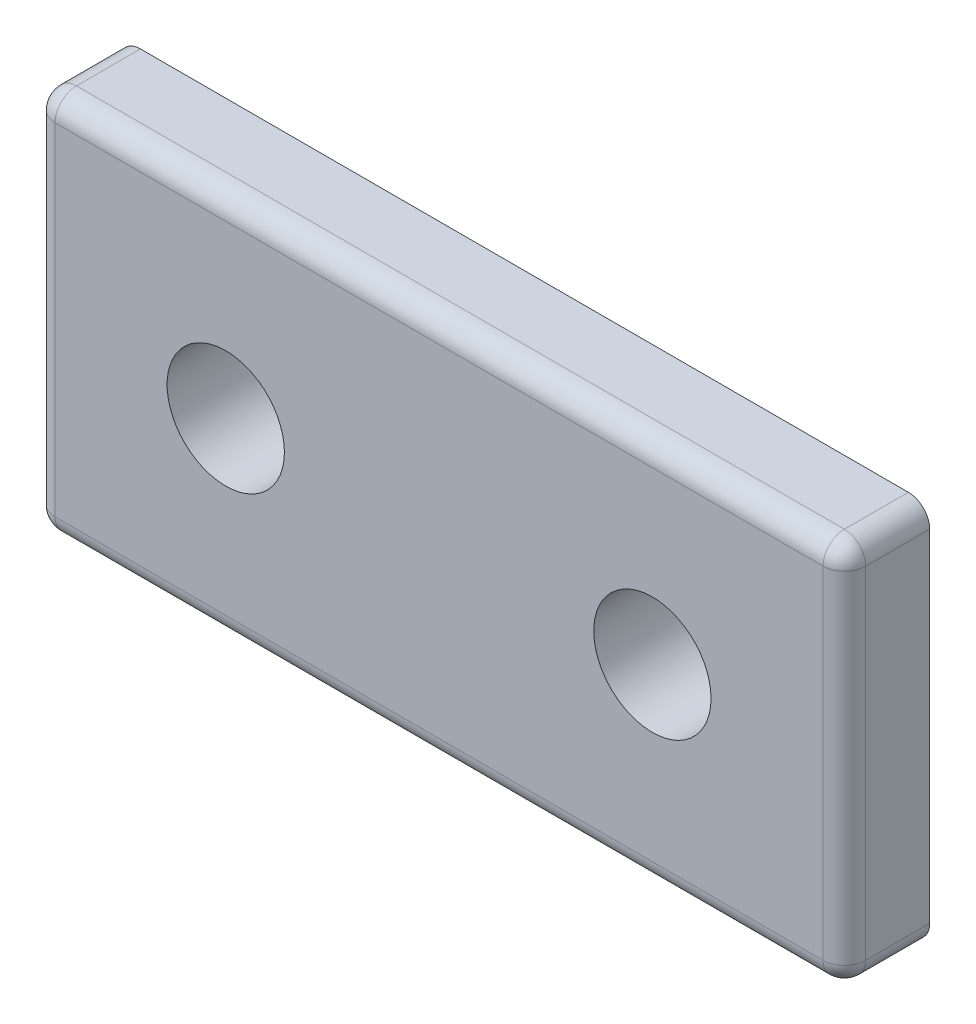
ISO-10303-21;
HEADER;
FILE_DESCRIPTION(('STEP AP214'),'2;1');
FILE_NAME('part.step','',(''),(''),'','','');
FILE_SCHEMA(('AUTOMOTIVE_DESIGN { 1 0 10303 214 1 1 1 1 }'));
ENDSEC;
DATA;
#1=APPLICATION_CONTEXT('core data for automotive mechanical design processes');
#2=APPLICATION_PROTOCOL_DEFINITION('international standard','automotive_design',2000,#1);
#3=PRODUCT_CONTEXT('',#1,'mechanical');
#4=PRODUCT('Part','Part','',(#3));
#5=PRODUCT_RELATED_PRODUCT_CATEGORY('part','',(#4));
#6=PRODUCT_DEFINITION_FORMATION('','',#4);
#7=PRODUCT_DEFINITION_CONTEXT('part definition',#1,'design');
#8=PRODUCT_DEFINITION('design','',#6,#7);
#9=PRODUCT_DEFINITION_SHAPE('','',#8);
#10=(LENGTH_UNIT() NAMED_UNIT(*) SI_UNIT(.MILLI.,.METRE.));
#11=(NAMED_UNIT(*) PLANE_ANGLE_UNIT() SI_UNIT($,.RADIAN.));
#12=(NAMED_UNIT(*) SI_UNIT($,.STERADIAN.) SOLID_ANGLE_UNIT());
#13=UNCERTAINTY_MEASURE_WITH_UNIT(LENGTH_MEASURE(1.E-05),#10,'distance_accuracy_value','');
#14=(GEOMETRIC_REPRESENTATION_CONTEXT(3) GLOBAL_UNCERTAINTY_ASSIGNED_CONTEXT((#13)) GLOBAL_UNIT_ASSIGNED_CONTEXT((#10,
#11,#12)) REPRESENTATION_CONTEXT('',''));
#15=CARTESIAN_POINT('',(0.,0.,0.));
#16=DIRECTION('',(0.,0.,1.));
#17=DIRECTION('',(1.,0.,0.));
#18=AXIS2_PLACEMENT_3D('',#15,#16,#17);
#19=CARTESIAN_POINT('',(0.,0.,2.));
#20=DIRECTION('',(0.,0.,-1.));
#21=DIRECTION('',(-1.,0.,0.));
#22=AXIS2_PLACEMENT_3D('',#19,#20,#21);
#23=PLANE('',#22);
#24=DIRECTION('',(-1.,0.,0.));
#25=VECTOR('',#24,1.);
#26=CARTESIAN_POINT('',(0.,17.,2.));
#27=LINE('',#26,#25);
#28=CARTESIAN_POINT('',(37.,17.,2.));
#29=VERTEX_POINT('',#28);
#30=CARTESIAN_POINT('',(1.,17.,2.));
#31=VERTEX_POINT('',#30);
#32=EDGE_CURVE('E286',#29,#31,#27,.T.);
#33=ORIENTED_EDGE('',*,*,#32,.T.);
#34=DIRECTION('',(0.,-1.,0.));
#35=VECTOR('',#34,1.);
#36=CARTESIAN_POINT('',(1.,0.,2.));
#37=LINE('',#36,#35);
#38=CARTESIAN_POINT('',(1.,1.,2.));
#39=VERTEX_POINT('',#38);
#40=EDGE_CURVE('E292',#31,#39,#37,.T.);
#41=ORIENTED_EDGE('',*,*,#40,.T.);
#42=DIRECTION('',(1.,0.,0.));
#43=VECTOR('',#42,1.);
#44=CARTESIAN_POINT('',(0.,1.,2.));
#45=LINE('',#44,#43);
#46=CARTESIAN_POINT('',(37.,1.,2.));
#47=VERTEX_POINT('',#46);
#48=EDGE_CURVE('E290',#39,#47,#45,.T.);
#49=ORIENTED_EDGE('',*,*,#48,.T.);
#50=DIRECTION('',(0.,1.,0.));
#51=VECTOR('',#50,1.);
#52=CARTESIAN_POINT('',(37.,0.,2.));
#53=LINE('',#52,#51);
#54=EDGE_CURVE('E288',#47,#29,#53,.T.);
#55=ORIENTED_EDGE('',*,*,#54,.T.);
#56=EDGE_LOOP('',(#33,#41,#49,#55));
#57=FACE_BOUND('',#56,.T.);
#58=CARTESIAN_POINT('',(9.,9.,2.));
#59=DIRECTION('',(0.,0.,1.));
#60=DIRECTION('',(1.,0.,0.));
#61=AXIS2_PLACEMENT_3D('',#58,#59,#60);
#62=CIRCLE('',#61,2.75);
#63=CARTESIAN_POINT('',(11.75,9.,2.));
#64=VERTEX_POINT('',#63);
#65=EDGE_CURVE('E262',#64,#64,#62,.T.);
#66=ORIENTED_EDGE('',*,*,#65,.F.);
#67=EDGE_LOOP('',(#66));
#68=FACE_BOUND('',#67,.T.);
#69=CARTESIAN_POINT('',(29.,9.,2.));
#70=DIRECTION('',(0.,0.,1.));
#71=DIRECTION('',(1.,0.,0.));
#72=AXIS2_PLACEMENT_3D('',#69,#70,#71);
#73=CIRCLE('',#72,2.75);
#74=CARTESIAN_POINT('',(31.75,9.,2.));
#75=VERTEX_POINT('',#74);
#76=EDGE_CURVE('E341',#75,#75,#73,.T.);
#77=ORIENTED_EDGE('',*,*,#76,.F.);
#78=EDGE_LOOP('',(#77));
#79=FACE_BOUND('',#78,.T.);
#80=ADVANCED_FACE('F158',(#57,#68,#79),#23,.F.);
#81=CARTESIAN_POINT('',(0.,0.,-2.));
#82=DIRECTION('',(0.,0.,-1.));
#83=DIRECTION('',(-1.,0.,0.));
#84=AXIS2_PLACEMENT_3D('',#81,#82,#83);
#85=PLANE('',#84);
#86=CARTESIAN_POINT('',(9.,9.,-2.));
#87=DIRECTION('',(0.,0.,1.));
#88=DIRECTION('',(1.,0.,0.));
#89=AXIS2_PLACEMENT_3D('',#86,#87,#88);
#90=CIRCLE('',#89,2.75);
#91=CARTESIAN_POINT('',(11.75,9.,-2.));
#92=VERTEX_POINT('',#91);
#93=EDGE_CURVE('E268',#92,#92,#90,.T.);
#94=ORIENTED_EDGE('',*,*,#93,.T.);
#95=EDGE_LOOP('',(#94));
#96=FACE_BOUND('',#95,.T.);
#97=DIRECTION('',(1.,0.,0.));
#98=VECTOR('',#97,1.);
#99=CARTESIAN_POINT('',(38.,0.,-2.));
#100=LINE('',#99,#98);
#101=CARTESIAN_POINT('',(1.,0.,-2.));
#102=VERTEX_POINT('',#101);
#103=CARTESIAN_POINT('',(37.,0.,-2.));
#104=VERTEX_POINT('',#103);
#105=EDGE_CURVE('E250',#102,#104,#100,.T.);
#106=ORIENTED_EDGE('',*,*,#105,.F.);
#107=CARTESIAN_POINT('',(1.,1.,-2.));
#108=DIRECTION('',(0.,0.,-1.));
#109=DIRECTION('',(-1.,0.,0.));
#110=AXIS2_PLACEMENT_3D('',#107,#108,#109);
#111=CIRCLE('',#110,1.);
#112=CARTESIAN_POINT('',(0.,1.,-2.));
#113=VERTEX_POINT('',#112);
#114=EDGE_CURVE('E234',#102,#113,#111,.T.);
#115=ORIENTED_EDGE('',*,*,#114,.T.);
#116=DIRECTION('',(0.,-1.,0.));
#117=VECTOR('',#116,1.);
#118=CARTESIAN_POINT('',(0.,0.,-2.));
#119=LINE('',#118,#117);
#120=CARTESIAN_POINT('',(0.,17.,-2.));
#121=VERTEX_POINT('',#120);
#122=EDGE_CURVE('E273',#121,#113,#119,.T.);
#123=ORIENTED_EDGE('',*,*,#122,.F.);
#124=CARTESIAN_POINT('',(1.,17.,-2.));
#125=DIRECTION('',(0.,0.,-1.));
#126=DIRECTION('',(-1.,0.,0.));
#127=AXIS2_PLACEMENT_3D('',#124,#125,#126);
#128=CIRCLE('',#127,1.);
#129=CARTESIAN_POINT('',(1.,18.,-2.));
#130=VERTEX_POINT('',#129);
#131=EDGE_CURVE('E255',#121,#130,#128,.T.);
#132=ORIENTED_EDGE('',*,*,#131,.T.);
#133=DIRECTION('',(-1.,0.,0.));
#134=VECTOR('',#133,1.);
#135=CARTESIAN_POINT('',(38.,18.,-2.));
#136=LINE('',#135,#134);
#137=CARTESIAN_POINT('',(37.,18.,-2.));
#138=VERTEX_POINT('',#137);
#139=EDGE_CURVE('E265',#138,#130,#136,.T.);
#140=ORIENTED_EDGE('',*,*,#139,.F.);
#141=CARTESIAN_POINT('',(37.,17.,-2.));
#142=DIRECTION('',(0.,0.,-1.));
#143=DIRECTION('',(-1.,0.,0.));
#144=AXIS2_PLACEMENT_3D('',#141,#142,#143);
#145=CIRCLE('',#144,1.);
#146=CARTESIAN_POINT('',(38.,17.,-2.));
#147=VERTEX_POINT('',#146);
#148=EDGE_CURVE('E279',#138,#147,#145,.T.);
#149=ORIENTED_EDGE('',*,*,#148,.T.);
#150=DIRECTION('',(0.,1.,0.));
#151=VECTOR('',#150,1.);
#152=CARTESIAN_POINT('',(38.,18.,-2.));
#153=LINE('',#152,#151);
#154=CARTESIAN_POINT('',(38.,1.,-2.));
#155=VERTEX_POINT('',#154);
#156=EDGE_CURVE('E261',#155,#147,#153,.T.);
#157=ORIENTED_EDGE('',*,*,#156,.F.);
#158=CARTESIAN_POINT('',(37.,1.,-2.));
#159=DIRECTION('',(0.,0.,-1.));
#160=DIRECTION('',(-1.,0.,0.));
#161=AXIS2_PLACEMENT_3D('',#158,#159,#160);
#162=CIRCLE('',#161,1.);
#163=EDGE_CURVE('E245',#155,#104,#162,.T.);
#164=ORIENTED_EDGE('',*,*,#163,.T.);
#165=EDGE_LOOP('',(#106,#115,#123,#132,#140,#149,#157,#164));
#166=FACE_BOUND('',#165,.T.);
#167=CARTESIAN_POINT('',(29.,9.,-2.));
#168=DIRECTION('',(0.,0.,1.));
#169=DIRECTION('',(1.,0.,0.));
#170=AXIS2_PLACEMENT_3D('',#167,#168,#169);
#171=CIRCLE('',#170,2.75);
#172=CARTESIAN_POINT('',(31.75,9.,-2.));
#173=VERTEX_POINT('',#172);
#174=EDGE_CURVE('E336',#173,#173,#171,.T.);
#175=ORIENTED_EDGE('',*,*,#174,.T.);
#176=EDGE_LOOP('',(#175));
#177=FACE_BOUND('',#176,.T.);
#178=ADVANCED_FACE('F257',(#96,#166,#177),#85,.T.);
#179=CARTESIAN_POINT('',(38.,0.,2.));
#180=DIRECTION('',(0.,1.,0.));
#181=DIRECTION('',(-1.,0.,0.));
#182=AXIS2_PLACEMENT_3D('',#179,#180,#181);
#183=PLANE('',#182);
#184=DIRECTION('',(1.,0.,0.));
#185=VECTOR('',#184,1.);
#186=CARTESIAN_POINT('',(38.,0.,1.));
#187=LINE('',#186,#185);
#188=CARTESIAN_POINT('',(37.,0.,1.));
#189=VERTEX_POINT('',#188);
#190=CARTESIAN_POINT('',(1.,0.,1.));
#191=VERTEX_POINT('',#190);
#192=EDGE_CURVE('E253',#189,#191,#187,.F.);
#193=ORIENTED_EDGE('',*,*,#192,.T.);
#194=DIRECTION('',(0.,0.,-1.));
#195=VECTOR('',#194,1.);
#196=CARTESIAN_POINT('',(1.,0.,2.));
#197=LINE('',#196,#195);
#198=EDGE_CURVE('E238',#191,#102,#197,.T.);
#199=ORIENTED_EDGE('',*,*,#198,.T.);
#200=ORIENTED_EDGE('',*,*,#105,.T.);
#201=DIRECTION('',(0.,0.,-1.));
#202=VECTOR('',#201,1.);
#203=CARTESIAN_POINT('',(37.,0.,2.));
#204=LINE('',#203,#202);
#205=EDGE_CURVE('E275',#104,#189,#204,.F.);
#206=ORIENTED_EDGE('',*,*,#205,.T.);
#207=EDGE_LOOP('',(#193,#199,#200,#206));
#208=FACE_BOUND('',#207,.T.);
#209=ADVANCED_FACE('F249',(#208),#183,.F.);
#210=CARTESIAN_POINT('',(38.,18.,2.));
#211=DIRECTION('',(-1.,0.,0.));
#212=DIRECTION('',(0.,0.,1.));
#213=AXIS2_PLACEMENT_3D('',#210,#211,#212);
#214=PLANE('',#213);
#215=DIRECTION('',(0.,1.,0.));
#216=VECTOR('',#215,1.);
#217=CARTESIAN_POINT('',(38.,18.,1.));
#218=LINE('',#217,#216);
#219=CARTESIAN_POINT('',(38.,17.,1.));
#220=VERTEX_POINT('',#219);
#221=CARTESIAN_POINT('',(38.,1.,1.));
#222=VERTEX_POINT('',#221);
#223=EDGE_CURVE('E297',#220,#222,#218,.F.);
#224=ORIENTED_EDGE('',*,*,#223,.T.);
#225=DIRECTION('',(0.,0.,-1.));
#226=VECTOR('',#225,1.);
#227=CARTESIAN_POINT('',(38.,1.,2.));
#228=LINE('',#227,#226);
#229=EDGE_CURVE('E299',#222,#155,#228,.T.);
#230=ORIENTED_EDGE('',*,*,#229,.T.);
#231=ORIENTED_EDGE('',*,*,#156,.T.);
#232=DIRECTION('',(0.,0.,-1.));
#233=VECTOR('',#232,1.);
#234=CARTESIAN_POINT('',(38.,17.,2.));
#235=LINE('',#234,#233);
#236=EDGE_CURVE('E295',#147,#220,#235,.F.);
#237=ORIENTED_EDGE('',*,*,#236,.T.);
#238=EDGE_LOOP('',(#224,#230,#231,#237));
#239=FACE_BOUND('',#238,.T.);
#240=ADVANCED_FACE('F377',(#239),#214,.F.);
#241=CARTESIAN_POINT('',(38.,18.,2.));
#242=DIRECTION('',(0.,-1.,0.));
#243=DIRECTION('',(1.,0.,0.));
#244=AXIS2_PLACEMENT_3D('',#241,#242,#243);
#245=PLANE('',#244);
#246=DIRECTION('',(-1.,0.,0.));
#247=VECTOR('',#246,1.);
#248=CARTESIAN_POINT('',(38.,18.,1.));
#249=LINE('',#248,#247);
#250=CARTESIAN_POINT('',(1.,18.,1.));
#251=VERTEX_POINT('',#250);
#252=CARTESIAN_POINT('',(37.,18.,1.));
#253=VERTEX_POINT('',#252);
#254=EDGE_CURVE('E167',#251,#253,#249,.F.);
#255=ORIENTED_EDGE('',*,*,#254,.T.);
#256=DIRECTION('',(0.,0.,-1.));
#257=VECTOR('',#256,1.);
#258=CARTESIAN_POINT('',(37.,18.,2.));
#259=LINE('',#258,#257);
#260=EDGE_CURVE('E12',#253,#138,#259,.T.);
#261=ORIENTED_EDGE('',*,*,#260,.T.);
#262=ORIENTED_EDGE('',*,*,#139,.T.);
#263=DIRECTION('',(0.,0.,-1.));
#264=VECTOR('',#263,1.);
#265=CARTESIAN_POINT('',(1.,18.,2.));
#266=LINE('',#265,#264);
#267=EDGE_CURVE('E178',#130,#251,#266,.F.);
#268=ORIENTED_EDGE('',*,*,#267,.T.);
#269=EDGE_LOOP('',(#255,#261,#262,#268));
#270=FACE_BOUND('',#269,.T.);
#271=ADVANCED_FACE('F363',(#270),#245,.F.);
#272=CARTESIAN_POINT('',(0.,0.,2.));
#273=DIRECTION('',(1.,0.,0.));
#274=DIRECTION('',(0.,0.,-1.));
#275=AXIS2_PLACEMENT_3D('',#272,#273,#274);
#276=PLANE('',#275);
#277=ORIENTED_EDGE('',*,*,#122,.T.);
#278=DIRECTION('',(0.,0.,-1.));
#279=VECTOR('',#278,1.);
#280=CARTESIAN_POINT('',(0.,1.,2.));
#281=LINE('',#280,#279);
#282=CARTESIAN_POINT('',(0.,1.,1.));
#283=VERTEX_POINT('',#282);
#284=EDGE_CURVE('E239',#113,#283,#281,.F.);
#285=ORIENTED_EDGE('',*,*,#284,.T.);
#286=DIRECTION('',(0.,-1.,0.));
#287=VECTOR('',#286,1.);
#288=CARTESIAN_POINT('',(0.,0.,1.));
#289=LINE('',#288,#287);
#290=CARTESIAN_POINT('',(0.,17.,1.));
#291=VERTEX_POINT('',#290);
#292=EDGE_CURVE('E283',#283,#291,#289,.F.);
#293=ORIENTED_EDGE('',*,*,#292,.T.);
#294=DIRECTION('',(0.,0.,-1.));
#295=VECTOR('',#294,1.);
#296=CARTESIAN_POINT('',(0.,17.,2.));
#297=LINE('',#296,#295);
#298=EDGE_CURVE('E244',#291,#121,#297,.T.);
#299=ORIENTED_EDGE('',*,*,#298,.T.);
#300=EDGE_LOOP('',(#277,#285,#293,#299));
#301=FACE_BOUND('',#300,.T.);
#302=ADVANCED_FACE('F355',(#301),#276,.F.);
#303=CARTESIAN_POINT('',(9.,9.,2.));
#304=DIRECTION('',(0.,0.,-1.));
#305=DIRECTION('',(-1.,0.,0.));
#306=AXIS2_PLACEMENT_3D('',#303,#304,#305);
#307=CYLINDRICAL_SURFACE('',#306,2.75);
#308=ORIENTED_EDGE('',*,*,#65,.T.);
#309=EDGE_LOOP('',(#308));
#310=FACE_BOUND('',#309,.T.);
#311=ORIENTED_EDGE('',*,*,#93,.F.);
#312=EDGE_LOOP('',(#311));
#313=FACE_BOUND('',#312,.T.);
#314=ADVANCED_FACE('F352',(#310,#313),#307,.F.);
#315=CARTESIAN_POINT('',(29.,9.,2.));
#316=DIRECTION('',(0.,0.,-1.));
#317=DIRECTION('',(-1.,0.,0.));
#318=AXIS2_PLACEMENT_3D('',#315,#316,#317);
#319=CYLINDRICAL_SURFACE('',#318,2.75);
#320=ORIENTED_EDGE('',*,*,#76,.T.);
#321=EDGE_LOOP('',(#320));
#322=FACE_BOUND('',#321,.T.);
#323=ORIENTED_EDGE('',*,*,#174,.F.);
#324=EDGE_LOOP('',(#323));
#325=FACE_BOUND('',#324,.T.);
#326=ADVANCED_FACE('F354',(#322,#325),#319,.F.);
#327=CARTESIAN_POINT('',(37.,17.,2.));
#328=DIRECTION('',(0.,0.,-1.));
#329=DIRECTION('',(-1.,0.,0.));
#330=AXIS2_PLACEMENT_3D('',#327,#328,#329);
#331=CYLINDRICAL_SURFACE('',#330,1.);
#332=CARTESIAN_POINT('',(37.,17.,1.));
#333=DIRECTION('',(0.,0.,1.));
#334=DIRECTION('',(1.,0.,0.));
#335=AXIS2_PLACEMENT_3D('',#332,#333,#334);
#336=CIRCLE('',#335,1.);
#337=EDGE_CURVE('E162',#220,#253,#336,.T.);
#338=ORIENTED_EDGE('',*,*,#337,.F.);
#339=ORIENTED_EDGE('',*,*,#236,.F.);
#340=ORIENTED_EDGE('',*,*,#148,.F.);
#341=ORIENTED_EDGE('',*,*,#260,.F.);
#342=EDGE_LOOP('',(#338,#339,#340,#341));
#343=FACE_BOUND('',#342,.T.);
#344=ADVANCED_FACE('F160',(#343),#331,.T.);
#345=CARTESIAN_POINT('',(37.,17.,1.));
#346=DIRECTION('',(0.,0.,1.));
#347=DIRECTION('',(1.,0.,0.));
#348=AXIS2_PLACEMENT_3D('',#345,#346,#347);
#349=SPHERICAL_SURFACE('',#348,1.);
#350=CARTESIAN_POINT('',(37.,17.,1.));
#351=DIRECTION('',(0.,1.,0.));
#352=DIRECTION('',(0.,0.,1.));
#353=AXIS2_PLACEMENT_3D('',#350,#351,#352);
#354=CIRCLE('',#353,1.);
#355=EDGE_CURVE('E328',#220,#29,#354,.F.);
#356=ORIENTED_EDGE('',*,*,#355,.F.);
#357=ORIENTED_EDGE('',*,*,#337,.T.);
#358=CARTESIAN_POINT('',(37.,17.,1.));
#359=DIRECTION('',(1.,0.,0.));
#360=DIRECTION('',(0.,0.,-1.));
#361=AXIS2_PLACEMENT_3D('',#358,#359,#360);
#362=CIRCLE('',#361,1.);
#363=EDGE_CURVE('E330',#29,#253,#362,.F.);
#364=ORIENTED_EDGE('',*,*,#363,.F.);
#365=EDGE_LOOP('',(#356,#357,#364));
#366=FACE_BOUND('',#365,.T.);
#367=ADVANCED_FACE('F418',(#366),#349,.T.);
#368=CARTESIAN_POINT('',(1.,17.,2.));
#369=DIRECTION('',(0.,0.,-1.));
#370=DIRECTION('',(-1.,0.,0.));
#371=AXIS2_PLACEMENT_3D('',#368,#369,#370);
#372=CYLINDRICAL_SURFACE('',#371,1.);
#373=ORIENTED_EDGE('',*,*,#131,.F.);
#374=ORIENTED_EDGE('',*,*,#298,.F.);
#375=CARTESIAN_POINT('',(1.,17.,1.));
#376=DIRECTION('',(0.,0.,1.));
#377=DIRECTION('',(1.,0.,0.));
#378=AXIS2_PLACEMENT_3D('',#375,#376,#377);
#379=CIRCLE('',#378,1.);
#380=EDGE_CURVE('E325',#251,#291,#379,.T.);
#381=ORIENTED_EDGE('',*,*,#380,.F.);
#382=ORIENTED_EDGE('',*,*,#267,.F.);
#383=EDGE_LOOP('',(#373,#374,#381,#382));
#384=FACE_BOUND('',#383,.T.);
#385=ADVANCED_FACE('F416',(#384),#372,.T.);
#386=CARTESIAN_POINT('',(0.,17.,1.));
#387=DIRECTION('',(-1.,0.,0.));
#388=DIRECTION('',(0.,-1.,0.));
#389=AXIS2_PLACEMENT_3D('',#386,#387,#388);
#390=CYLINDRICAL_SURFACE('',#389,1.);
#391=ORIENTED_EDGE('',*,*,#363,.T.);
#392=ORIENTED_EDGE('',*,*,#254,.F.);
#393=CARTESIAN_POINT('',(1.,17.,1.));
#394=DIRECTION('',(-1.,0.,0.));
#395=DIRECTION('',(0.,0.,1.));
#396=AXIS2_PLACEMENT_3D('',#393,#394,#395);
#397=CIRCLE('',#396,1.);
#398=EDGE_CURVE('E322',#31,#251,#397,.T.);
#399=ORIENTED_EDGE('',*,*,#398,.F.);
#400=ORIENTED_EDGE('',*,*,#32,.F.);
#401=EDGE_LOOP('',(#391,#392,#399,#400));
#402=FACE_BOUND('',#401,.T.);
#403=ADVANCED_FACE('F412',(#402),#390,.T.);
#404=CARTESIAN_POINT('',(37.,0.,1.));
#405=DIRECTION('',(0.,1.,0.));
#406=DIRECTION('',(0.,0.,1.));
#407=AXIS2_PLACEMENT_3D('',#404,#405,#406);
#408=CYLINDRICAL_SURFACE('',#407,1.);
#409=ORIENTED_EDGE('',*,*,#355,.T.);
#410=ORIENTED_EDGE('',*,*,#54,.F.);
#411=CARTESIAN_POINT('',(37.,1.,1.));
#412=DIRECTION('',(0.,-1.,0.));
#413=DIRECTION('',(0.,0.,-1.));
#414=AXIS2_PLACEMENT_3D('',#411,#412,#413);
#415=CIRCLE('',#414,1.);
#416=EDGE_CURVE('E319',#222,#47,#415,.T.);
#417=ORIENTED_EDGE('',*,*,#416,.F.);
#418=ORIENTED_EDGE('',*,*,#223,.F.);
#419=EDGE_LOOP('',(#409,#410,#417,#418));
#420=FACE_BOUND('',#419,.T.);
#421=ADVANCED_FACE('F408',(#420),#408,.T.);
#422=CARTESIAN_POINT('',(37.,1.,2.));
#423=DIRECTION('',(0.,0.,-1.));
#424=DIRECTION('',(-1.,0.,0.));
#425=AXIS2_PLACEMENT_3D('',#422,#423,#424);
#426=CYLINDRICAL_SURFACE('',#425,1.);
#427=ORIENTED_EDGE('',*,*,#163,.F.);
#428=ORIENTED_EDGE('',*,*,#229,.F.);
#429=CARTESIAN_POINT('',(37.,1.,1.));
#430=DIRECTION('',(0.,0.,1.));
#431=DIRECTION('',(1.,0.,0.));
#432=AXIS2_PLACEMENT_3D('',#429,#430,#431);
#433=CIRCLE('',#432,1.);
#434=EDGE_CURVE('E316',#189,#222,#433,.T.);
#435=ORIENTED_EDGE('',*,*,#434,.F.);
#436=ORIENTED_EDGE('',*,*,#205,.F.);
#437=EDGE_LOOP('',(#427,#428,#435,#436));
#438=FACE_BOUND('',#437,.T.);
#439=ADVANCED_FACE('F404',(#438),#426,.T.);
#440=CARTESIAN_POINT('',(1.,17.,1.));
#441=DIRECTION('',(0.,0.,1.));
#442=DIRECTION('',(1.,0.,0.));
#443=AXIS2_PLACEMENT_3D('',#440,#441,#442);
#444=SPHERICAL_SURFACE('',#443,1.);
#445=ORIENTED_EDGE('',*,*,#398,.T.);
#446=ORIENTED_EDGE('',*,*,#380,.T.);
#447=CARTESIAN_POINT('',(1.,17.,1.));
#448=DIRECTION('',(0.,1.,0.));
#449=DIRECTION('',(0.,0.,1.));
#450=AXIS2_PLACEMENT_3D('',#447,#448,#449);
#451=CIRCLE('',#450,1.);
#452=EDGE_CURVE('E313',#31,#291,#451,.F.);
#453=ORIENTED_EDGE('',*,*,#452,.F.);
#454=EDGE_LOOP('',(#445,#446,#453));
#455=FACE_BOUND('',#454,.T.);
#456=ADVANCED_FACE('F400',(#455),#444,.T.);
#457=CARTESIAN_POINT('',(37.,1.,1.));
#458=DIRECTION('',(0.,0.,1.));
#459=DIRECTION('',(1.,0.,0.));
#460=AXIS2_PLACEMENT_3D('',#457,#458,#459);
#461=SPHERICAL_SURFACE('',#460,1.);
#462=ORIENTED_EDGE('',*,*,#434,.T.);
#463=ORIENTED_EDGE('',*,*,#416,.T.);
#464=CARTESIAN_POINT('',(37.,1.,1.));
#465=DIRECTION('',(1.,0.,0.));
#466=DIRECTION('',(0.,0.,-1.));
#467=AXIS2_PLACEMENT_3D('',#464,#465,#466);
#468=CIRCLE('',#467,1.);
#469=EDGE_CURVE('E310',#189,#47,#468,.F.);
#470=ORIENTED_EDGE('',*,*,#469,.F.);
#471=EDGE_LOOP('',(#462,#463,#470));
#472=FACE_BOUND('',#471,.T.);
#473=ADVANCED_FACE('F396',(#472),#461,.T.);
#474=CARTESIAN_POINT('',(1.,0.,1.));
#475=DIRECTION('',(0.,-1.,0.));
#476=DIRECTION('',(0.,0.,-1.));
#477=AXIS2_PLACEMENT_3D('',#474,#475,#476);
#478=CYLINDRICAL_SURFACE('',#477,1.);
#479=ORIENTED_EDGE('',*,*,#452,.T.);
#480=ORIENTED_EDGE('',*,*,#292,.F.);
#481=CARTESIAN_POINT('',(1.,1.,1.));
#482=DIRECTION('',(0.,-1.,0.));
#483=DIRECTION('',(0.,0.,-1.));
#484=AXIS2_PLACEMENT_3D('',#481,#482,#483);
#485=CIRCLE('',#484,1.);
#486=EDGE_CURVE('E307',#39,#283,#485,.T.);
#487=ORIENTED_EDGE('',*,*,#486,.F.);
#488=ORIENTED_EDGE('',*,*,#40,.F.);
#489=EDGE_LOOP('',(#479,#480,#487,#488));
#490=FACE_BOUND('',#489,.T.);
#491=ADVANCED_FACE('F392',(#490),#478,.T.);
#492=CARTESIAN_POINT('',(0.,1.,1.));
#493=DIRECTION('',(1.,0.,0.));
#494=DIRECTION('',(0.,1.,0.));
#495=AXIS2_PLACEMENT_3D('',#492,#493,#494);
#496=CYLINDRICAL_SURFACE('',#495,1.);
#497=ORIENTED_EDGE('',*,*,#469,.T.);
#498=ORIENTED_EDGE('',*,*,#48,.F.);
#499=CARTESIAN_POINT('',(1.,1.,1.));
#500=DIRECTION('',(-1.,0.,0.));
#501=DIRECTION('',(0.,0.,1.));
#502=AXIS2_PLACEMENT_3D('',#499,#500,#501);
#503=CIRCLE('',#502,1.);
#504=EDGE_CURVE('E305',#191,#39,#503,.T.);
#505=ORIENTED_EDGE('',*,*,#504,.F.);
#506=ORIENTED_EDGE('',*,*,#192,.F.);
#507=EDGE_LOOP('',(#497,#498,#505,#506));
#508=FACE_BOUND('',#507,.T.);
#509=ADVANCED_FACE('F388',(#508),#496,.T.);
#510=CARTESIAN_POINT('',(1.,1.,1.));
#511=DIRECTION('',(0.,0.,1.));
#512=DIRECTION('',(1.,0.,0.));
#513=AXIS2_PLACEMENT_3D('',#510,#511,#512);
#514=SPHERICAL_SURFACE('',#513,1.);
#515=ORIENTED_EDGE('',*,*,#504,.T.);
#516=ORIENTED_EDGE('',*,*,#486,.T.);
#517=CARTESIAN_POINT('',(1.,1.,1.));
#518=DIRECTION('',(0.,0.,1.));
#519=DIRECTION('',(1.,0.,0.));
#520=AXIS2_PLACEMENT_3D('',#517,#518,#519);
#521=CIRCLE('',#520,1.);
#522=EDGE_CURVE('E303',#191,#283,#521,.F.);
#523=ORIENTED_EDGE('',*,*,#522,.F.);
#524=EDGE_LOOP('',(#515,#516,#523));
#525=FACE_BOUND('',#524,.T.);
#526=ADVANCED_FACE('F385',(#525),#514,.T.);
#527=CARTESIAN_POINT('',(1.,1.,2.));
#528=DIRECTION('',(0.,0.,-1.));
#529=DIRECTION('',(-1.,0.,0.));
#530=AXIS2_PLACEMENT_3D('',#527,#528,#529);
#531=CYLINDRICAL_SURFACE('',#530,1.);
#532=ORIENTED_EDGE('',*,*,#522,.T.);
#533=ORIENTED_EDGE('',*,*,#284,.F.);
#534=ORIENTED_EDGE('',*,*,#114,.F.);
#535=ORIENTED_EDGE('',*,*,#198,.F.);
#536=EDGE_LOOP('',(#532,#533,#534,#535));
#537=FACE_BOUND('',#536,.T.);
#538=ADVANCED_FACE('F237',(#537),#531,.T.);
#539=CLOSED_SHELL('',(#80,#178,#209,#240,#271,#302,#314,#326,#344,#367,#385,#403,#421,#439,#456,
#473,#491,#509,#526,#538));
#540=MANIFOLD_SOLID_BREP('B2',#539);
#541=ADVANCED_BREP_SHAPE_REPRESENTATION('',(#18,#540),#14);
#542=SHAPE_DEFINITION_REPRESENTATION(#9,#541);
ENDSEC;
END-ISO-10303-21;
